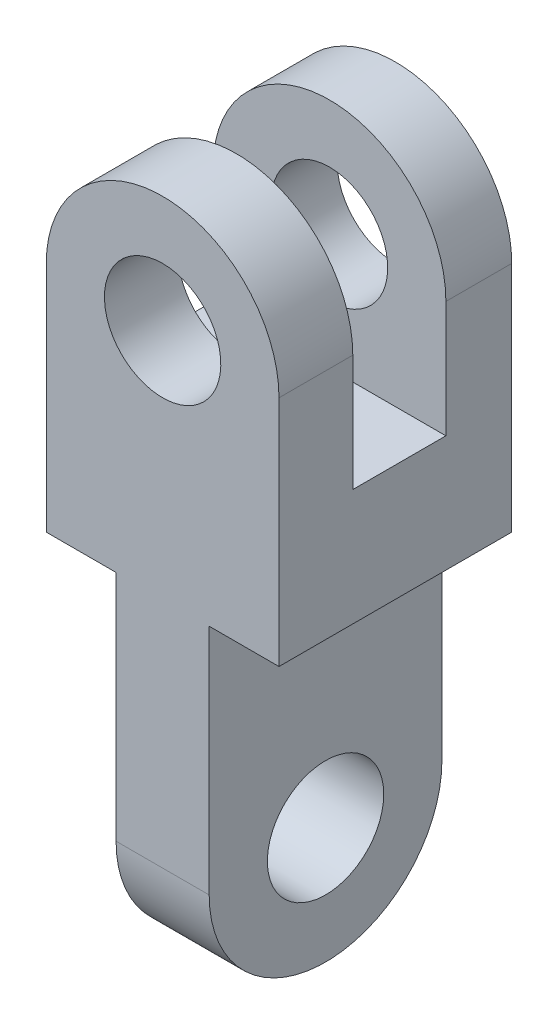
ISO-10303-21;
HEADER;
FILE_DESCRIPTION(('STEP AP214'),'2;1');
FILE_NAME('part.step','',(''),(''),'','','');
FILE_SCHEMA(('AUTOMOTIVE_DESIGN { 1 0 10303 214 1 1 1 1 }'));
ENDSEC;
DATA;
#1=APPLICATION_CONTEXT('core data for automotive mechanical design processes');
#2=APPLICATION_PROTOCOL_DEFINITION('international standard','automotive_design',2000,#1);
#3=PRODUCT_CONTEXT('',#1,'mechanical');
#4=PRODUCT('Part','Part','',(#3));
#5=PRODUCT_RELATED_PRODUCT_CATEGORY('part','',(#4));
#6=PRODUCT_DEFINITION_FORMATION('','',#4);
#7=PRODUCT_DEFINITION_CONTEXT('part definition',#1,'design');
#8=PRODUCT_DEFINITION('design','',#6,#7);
#9=PRODUCT_DEFINITION_SHAPE('','',#8);
#10=(LENGTH_UNIT() NAMED_UNIT(*) SI_UNIT(.MILLI.,.METRE.));
#11=(NAMED_UNIT(*) PLANE_ANGLE_UNIT() SI_UNIT($,.RADIAN.));
#12=(NAMED_UNIT(*) SI_UNIT($,.STERADIAN.) SOLID_ANGLE_UNIT());
#13=UNCERTAINTY_MEASURE_WITH_UNIT(LENGTH_MEASURE(1.E-05),#10,'distance_accuracy_value','');
#14=(GEOMETRIC_REPRESENTATION_CONTEXT(3) GLOBAL_UNCERTAINTY_ASSIGNED_CONTEXT((#13)) GLOBAL_UNIT_ASSIGNED_CONTEXT((#10,
#11,#12)) REPRESENTATION_CONTEXT('',''));
#15=CARTESIAN_POINT('',(0.,0.,0.));
#16=DIRECTION('',(0.,0.,1.));
#17=DIRECTION('',(1.,0.,0.));
#18=AXIS2_PLACEMENT_3D('',#15,#16,#17);
#19=CARTESIAN_POINT('',(0.,99.9999999999999,230.2775637732));
#20=DIRECTION('',(0.,0.,-1.));
#21=DIRECTION('',(0.,1.,0.));
#22=AXIS2_PLACEMENT_3D('',#19,#20,#21);
#23=CYLINDRICAL_SURFACE('',#22,50.);
#24=CARTESIAN_POINT('',(0.,100.,-21.7065790789583));
#25=DIRECTION('',(0.,0.,-1.));
#26=DIRECTION('',(0.,1.,0.));
#27=AXIS2_PLACEMENT_3D('',#24,#25,#26);
#28=CIRCLE('',#27,50.);
#29=CARTESIAN_POINT('',(50.,100.,-21.7065790789583));
#30=VERTEX_POINT('',#29);
#31=CARTESIAN_POINT('',(-50.,100.,-21.7065790789583));
#32=VERTEX_POINT('',#31);
#33=EDGE_CURVE('E163',#30,#32,#28,.F.);
#34=ORIENTED_EDGE('',*,*,#33,.F.);
#35=DIRECTION('',(0.,0.,-1.));
#36=VECTOR('',#35,1.);
#37=CARTESIAN_POINT('',(50.,99.9999999999999,230.2775637732));
#38=LINE('',#37,#36);
#39=CARTESIAN_POINT('',(50.,100.,-50.));
#40=VERTEX_POINT('',#39);
#41=EDGE_CURVE('E238',#30,#40,#38,.T.);
#42=ORIENTED_EDGE('',*,*,#41,.T.);
#43=CARTESIAN_POINT('',(0.,100.,-50.));
#44=DIRECTION('',(0.,0.,-1.));
#45=DIRECTION('',(0.,-1.,0.));
#46=AXIS2_PLACEMENT_3D('',#43,#44,#45);
#47=CIRCLE('',#46,50.);
#48=CARTESIAN_POINT('',(-50.,100.,-50.));
#49=VERTEX_POINT('',#48);
#50=EDGE_CURVE('E215',#49,#40,#47,.T.);
#51=ORIENTED_EDGE('',*,*,#50,.F.);
#52=DIRECTION('',(0.,0.,-1.));
#53=VECTOR('',#52,1.);
#54=CARTESIAN_POINT('',(-50.,100.,230.2775637732));
#55=LINE('',#54,#53);
#56=EDGE_CURVE('E227',#32,#49,#55,.T.);
#57=ORIENTED_EDGE('',*,*,#56,.F.);
#58=EDGE_LOOP('',(#34,#42,#51,#57));
#59=FACE_BOUND('',#58,.T.);
#60=ADVANCED_FACE('F45',(#59),#23,.T.);
#61=CARTESIAN_POINT('',(0.,99.9999999999999,230.2775637732));
#62=DIRECTION('',(0.,0.,-1.));
#63=DIRECTION('',(0.,1.,0.));
#64=AXIS2_PLACEMENT_3D('',#61,#62,#63);
#65=CYLINDRICAL_SURFACE('',#64,25.);
#66=CARTESIAN_POINT('',(0.,100.,-21.7065790789583));
#67=DIRECTION('',(0.,0.,-1.));
#68=DIRECTION('',(0.,1.,0.));
#69=AXIS2_PLACEMENT_3D('',#66,#67,#68);
#70=CIRCLE('',#69,25.);
#71=CARTESIAN_POINT('',(0.,125.,-21.7065790789583));
#72=VERTEX_POINT('',#71);
#73=EDGE_CURVE('E49',#72,#72,#70,.F.);
#74=CARTESIAN_POINT('',(0.,100.,-50.));
#75=DIRECTION('',(0.,0.,-1.));
#76=DIRECTION('',(0.,1.,0.));
#77=AXIS2_PLACEMENT_3D('',#74,#75,#76);
#78=CIRCLE('',#77,25.);
#79=CARTESIAN_POINT('',(0.,125.,-50.));
#80=VERTEX_POINT('',#79);
#81=EDGE_CURVE('E192',#80,#80,#78,.T.);
#82=CARTESIAN_POINT('',(0.,125.,-21.7065790789583));
#83=CARTESIAN_POINT('',(0.,125.,-22.0013022135525));
#84=CARTESIAN_POINT('',(0.,125.,-22.2960253481467));
#85=CARTESIAN_POINT('',(0.,125.,-22.885471617335));
#86=CARTESIAN_POINT('',(0.,125.,-23.1801947519292));
#87=CARTESIAN_POINT('',(0.,125.,-23.7696410211176));
#88=CARTESIAN_POINT('',(0.,125.,-24.0643641557118));
#89=CARTESIAN_POINT('',(0.,125.,-24.6538104249001));
#90=CARTESIAN_POINT('',(0.,125.,-24.9485335594943));
#91=CARTESIAN_POINT('',(0.,125.,-25.5379798286827));
#92=CARTESIAN_POINT('',(0.,125.,-25.8327029632769));
#93=CARTESIAN_POINT('',(0.,125.,-26.4221492324652));
#94=CARTESIAN_POINT('',(0.,125.,-26.7168723670594));
#95=CARTESIAN_POINT('',(0.,125.,-27.3063186362478));
#96=CARTESIAN_POINT('',(0.,125.,-27.601041770842));
#97=CARTESIAN_POINT('',(0.,125.,-28.1904880400303));
#98=CARTESIAN_POINT('',(0.,125.,-28.4852111746245));
#99=CARTESIAN_POINT('',(0.,125.,-29.0746574438129));
#100=CARTESIAN_POINT('',(0.,125.,-29.3693805784071));
#101=CARTESIAN_POINT('',(0.,125.,-29.9588268475955));
#102=CARTESIAN_POINT('',(0.,125.,-30.2535499821896));
#103=CARTESIAN_POINT('',(0.,125.,-30.842996251378));
#104=CARTESIAN_POINT('',(0.,125.,-31.1377193859722));
#105=CARTESIAN_POINT('',(0.,125.,-31.7271656551606));
#106=CARTESIAN_POINT('',(0.,125.,-32.0218887897547));
#107=CARTESIAN_POINT('',(0.,125.,-32.6113350589431));
#108=CARTESIAN_POINT('',(0.,125.,-32.9060581935373));
#109=CARTESIAN_POINT('',(0.,125.,-33.4955044627257));
#110=CARTESIAN_POINT('',(0.,125.,-33.7902275973198));
#111=CARTESIAN_POINT('',(0.,125.,-34.3796738665082));
#112=CARTESIAN_POINT('',(0.,125.,-34.6743970011024));
#113=CARTESIAN_POINT('',(0.,125.,-35.2638432702908));
#114=CARTESIAN_POINT('',(0.,125.,-35.5585664048849));
#115=CARTESIAN_POINT('',(0.,125.,-36.1480126740733));
#116=CARTESIAN_POINT('',(0.,125.,-36.4427358086675));
#117=CARTESIAN_POINT('',(0.,125.,-37.0321820778559));
#118=CARTESIAN_POINT('',(0.,125.,-37.3269052124501));
#119=CARTESIAN_POINT('',(0.,125.,-37.9163514816384));
#120=CARTESIAN_POINT('',(0.,125.,-38.2110746162326));
#121=CARTESIAN_POINT('',(0.,125.,-38.800520885421));
#122=CARTESIAN_POINT('',(0.,125.,-39.0952440200152));
#123=CARTESIAN_POINT('',(0.,125.,-39.6846902892035));
#124=CARTESIAN_POINT('',(0.,125.,-39.9794134237977));
#125=CARTESIAN_POINT('',(0.,125.,-40.5688596929861));
#126=CARTESIAN_POINT('',(0.,125.,-40.8635828275803));
#127=CARTESIAN_POINT('',(0.,125.,-41.4530290967686));
#128=CARTESIAN_POINT('',(0.,125.,-41.7477522313628));
#129=CARTESIAN_POINT('',(0.,125.,-42.3371985005512));
#130=CARTESIAN_POINT('',(0.,125.,-42.6319216351454));
#131=CARTESIAN_POINT('',(0.,125.,-43.2213679043338));
#132=CARTESIAN_POINT('',(0.,125.,-43.5160910389279));
#133=CARTESIAN_POINT('',(0.,125.,-44.1055373081163));
#134=CARTESIAN_POINT('',(0.,125.,-44.4002604427105));
#135=CARTESIAN_POINT('',(0.,125.,-44.9897067118989));
#136=CARTESIAN_POINT('',(0.,125.,-45.284429846493));
#137=CARTESIAN_POINT('',(0.,125.,-45.8738761156814));
#138=CARTESIAN_POINT('',(0.,125.,-46.1685992502756));
#139=CARTESIAN_POINT('',(0.,125.,-46.758045519464));
#140=CARTESIAN_POINT('',(0.,125.,-47.0527686540581));
#141=CARTESIAN_POINT('',(0.,125.,-47.6422149232465));
#142=CARTESIAN_POINT('',(0.,125.,-47.9369380578407));
#143=CARTESIAN_POINT('',(0.,125.,-48.5263843270291));
#144=CARTESIAN_POINT('',(0.,125.,-48.8211074616232));
#145=CARTESIAN_POINT('',(0.,125.,-49.4105537308116));
#146=CARTESIAN_POINT('',(0.,125.,-49.7052768654058));
#147=CARTESIAN_POINT('',(0.,125.,-50.));
#148=B_SPLINE_CURVE_WITH_KNOTS('',3,(#82,#83,#84,#85,#86,#87,#88,#89,#90,#91,#92,#93,#94,#95,
#96,#97,#98,#99,#100,#101,#102,#103,#104,#105,#106,#107,#108,#109,#110,#111,#112,#113,#114,#115,
#116,#117,#118,#119,#120,#121,#122,#123,#124,#125,#126,#127,#128,#129,#130,#131,#132,#133,#134,
#135,#136,#137,#138,#139,#140,#141,#142,#143,#144,#145,#146,#147),.UNSPECIFIED.,.F.,.F.,(4,2,2,
2,2,2,2,2,2,2,2,2,2,2,2,2,2,2,2,2,2,2,2,2,2,2,2,2,2,2,2,2,4),(0.,0.884169403782553,
1.76833880756511,2.65250821134766,3.53667761513021,4.42084701891277,5.30501642269532,
6.18918582647787,7.07335523026043,7.95752463404298,8.84169403782553,9.72586344160808,
10.6100328453906,11.4942022491732,12.3783716529557,13.2625410567383,14.1467104605209,
15.0308798643034,15.915049268086,16.7992186718685,17.6833880756511,18.5675574794336,
19.4517268832162,20.3358962869987,21.2200656907813,22.1042350945638,22.9884044983464,
23.8725739021289,24.7567433059115,25.640912709694,26.5250821134766,27.4092515172591,
28.2934209210417),.UNSPECIFIED.);
#149=EDGE_CURVE('BSEAM295',#72,#80,#148,.T.);
#150=ORIENTED_EDGE('',*,*,#73,.T.);
#151=ORIENTED_EDGE('',*,*,#81,.T.);
#152=ORIENTED_EDGE('',*,*,#149,.T.);
#153=ORIENTED_EDGE('',*,*,#149,.F.);
#154=EDGE_LOOP('',(#150,#152,#151,#153));
#155=FACE_BOUND('',#154,.T.);
#156=ADVANCED_FACE('F295',(#155),#65,.F.);
#157=CARTESIAN_POINT('',(20.,-100.,0.));
#158=DIRECTION('',(1.,0.,0.));
#159=DIRECTION('',(0.,0.,-1.));
#160=AXIS2_PLACEMENT_3D('',#157,#158,#159);
#161=PLANE('',#160);
#162=CARTESIAN_POINT('',(20.,-100.,0.));
#163=DIRECTION('',(1.,0.,0.));
#164=DIRECTION('',(0.,0.,-1.));
#165=AXIS2_PLACEMENT_3D('',#162,#163,#164);
#166=CIRCLE('',#165,50.);
#167=CARTESIAN_POINT('',(20.,-100.,50.));
#168=VERTEX_POINT('',#167);
#169=CARTESIAN_POINT('',(20.,-100.,-50.));
#170=VERTEX_POINT('',#169);
#171=EDGE_CURVE('E254',#168,#170,#166,.T.);
#172=ORIENTED_EDGE('',*,*,#171,.T.);
#173=DIRECTION('',(0.,1.,0.));
#174=VECTOR('',#173,1.);
#175=CARTESIAN_POINT('',(20.,0.,-50.));
#176=LINE('',#175,#174);
#177=CARTESIAN_POINT('',(20.,0.,-50.));
#178=VERTEX_POINT('',#177);
#179=EDGE_CURVE('E93',#170,#178,#176,.T.);
#180=ORIENTED_EDGE('',*,*,#179,.T.);
#181=DIRECTION('',(0.,0.,1.));
#182=VECTOR('',#181,1.);
#183=CARTESIAN_POINT('',(20.,0.,50.));
#184=LINE('',#183,#182);
#185=CARTESIAN_POINT('',(20.,0.,50.));
#186=VERTEX_POINT('',#185);
#187=EDGE_CURVE('E259',#178,#186,#184,.T.);
#188=ORIENTED_EDGE('',*,*,#187,.T.);
#189=DIRECTION('',(0.,-1.,0.));
#190=VECTOR('',#189,1.);
#191=CARTESIAN_POINT('',(20.,0.,50.));
#192=LINE('',#191,#190);
#193=EDGE_CURVE('E72',#186,#168,#192,.T.);
#194=ORIENTED_EDGE('',*,*,#193,.T.);
#195=EDGE_LOOP('',(#172,#180,#188,#194));
#196=FACE_BOUND('',#195,.T.);
#197=CARTESIAN_POINT('',(20.,-100.,0.));
#198=DIRECTION('',(1.,0.,0.));
#199=DIRECTION('',(0.,0.,-1.));
#200=AXIS2_PLACEMENT_3D('',#197,#198,#199);
#201=CIRCLE('',#200,25.);
#202=CARTESIAN_POINT('',(20.,-100.,-25.));
#203=VERTEX_POINT('',#202);
#204=EDGE_CURVE('E246',#203,#203,#201,.T.);
#205=ORIENTED_EDGE('',*,*,#204,.F.);
#206=EDGE_LOOP('',(#205));
#207=FACE_BOUND('',#206,.T.);
#208=ADVANCED_FACE('F303',(#196,#207),#161,.T.);
#209=CARTESIAN_POINT('',(-20.,-100.,0.));
#210=DIRECTION('',(1.,0.,0.));
#211=DIRECTION('',(0.,0.,-1.));
#212=AXIS2_PLACEMENT_3D('',#209,#210,#211);
#213=PLANE('',#212);
#214=CARTESIAN_POINT('',(-20.,-100.,0.));
#215=DIRECTION('',(1.,0.,0.));
#216=DIRECTION('',(0.,0.,-1.));
#217=AXIS2_PLACEMENT_3D('',#214,#215,#216);
#218=CIRCLE('',#217,50.);
#219=CARTESIAN_POINT('',(-20.,-100.,50.));
#220=VERTEX_POINT('',#219);
#221=CARTESIAN_POINT('',(-20.,-100.,-50.));
#222=VERTEX_POINT('',#221);
#223=EDGE_CURVE('E250',#220,#222,#218,.T.);
#224=ORIENTED_EDGE('',*,*,#223,.F.);
#225=DIRECTION('',(0.,-1.,0.));
#226=VECTOR('',#225,1.);
#227=CARTESIAN_POINT('',(-20.,0.,50.));
#228=LINE('',#227,#226);
#229=CARTESIAN_POINT('',(-20.,0.,50.));
#230=VERTEX_POINT('',#229);
#231=EDGE_CURVE('E87',#230,#220,#228,.T.);
#232=ORIENTED_EDGE('',*,*,#231,.F.);
#233=DIRECTION('',(0.,0.,1.));
#234=VECTOR('',#233,1.);
#235=CARTESIAN_POINT('',(-20.,0.,50.));
#236=LINE('',#235,#234);
#237=CARTESIAN_POINT('',(-20.,0.,-50.));
#238=VERTEX_POINT('',#237);
#239=EDGE_CURVE('E271',#238,#230,#236,.T.);
#240=ORIENTED_EDGE('',*,*,#239,.F.);
#241=DIRECTION('',(0.,1.,0.));
#242=VECTOR('',#241,1.);
#243=CARTESIAN_POINT('',(-20.,0.,-50.));
#244=LINE('',#243,#242);
#245=EDGE_CURVE('E267',#222,#238,#244,.T.);
#246=ORIENTED_EDGE('',*,*,#245,.F.);
#247=EDGE_LOOP('',(#224,#232,#240,#246));
#248=FACE_BOUND('',#247,.T.);
#249=CARTESIAN_POINT('',(-20.,-100.,0.));
#250=DIRECTION('',(1.,0.,0.));
#251=DIRECTION('',(0.,0.,-1.));
#252=AXIS2_PLACEMENT_3D('',#249,#250,#251);
#253=CIRCLE('',#252,25.);
#254=CARTESIAN_POINT('',(-20.,-100.,-25.));
#255=VERTEX_POINT('',#254);
#256=EDGE_CURVE('E245',#255,#255,#253,.T.);
#257=ORIENTED_EDGE('',*,*,#256,.T.);
#258=EDGE_LOOP('',(#257));
#259=FACE_BOUND('',#258,.T.);
#260=ADVANCED_FACE('F336',(#248,#259),#213,.F.);
#261=CARTESIAN_POINT('',(20.,-100.,0.));
#262=DIRECTION('',(-1.,0.,0.));
#263=DIRECTION('',(0.,0.,1.));
#264=AXIS2_PLACEMENT_3D('',#261,#262,#263);
#265=CYLINDRICAL_SURFACE('',#264,50.);
#266=ORIENTED_EDGE('',*,*,#223,.T.);
#267=DIRECTION('',(-1.,0.,0.));
#268=VECTOR('',#267,1.);
#269=CARTESIAN_POINT('',(20.,-100.,-50.));
#270=LINE('',#269,#268);
#271=EDGE_CURVE('E11',#170,#222,#270,.T.);
#272=ORIENTED_EDGE('',*,*,#271,.F.);
#273=ORIENTED_EDGE('',*,*,#171,.F.);
#274=DIRECTION('',(-1.,0.,0.));
#275=VECTOR('',#274,1.);
#276=CARTESIAN_POINT('',(20.,-100.,50.));
#277=LINE('',#276,#275);
#278=EDGE_CURVE('E55',#168,#220,#277,.T.);
#279=ORIENTED_EDGE('',*,*,#278,.T.);
#280=EDGE_LOOP('',(#266,#272,#273,#279));
#281=FACE_BOUND('',#280,.T.);
#282=ADVANCED_FACE('F47',(#281),#265,.T.);
#283=CARTESIAN_POINT('',(20.,0.,-50.));
#284=DIRECTION('',(0.,0.,1.));
#285=DIRECTION('',(0.,-1.,0.));
#286=AXIS2_PLACEMENT_3D('',#283,#284,#285);
#287=PLANE('',#286);
#288=ORIENTED_EDGE('',*,*,#245,.T.);
#289=DIRECTION('',(-1.,0.,0.));
#290=VECTOR('',#289,1.);
#291=CARTESIAN_POINT('',(50.,0.,-50.));
#292=LINE('',#291,#290);
#293=CARTESIAN_POINT('',(-50.,0.,-50.));
#294=VERTEX_POINT('',#293);
#295=EDGE_CURVE('E223',#238,#294,#292,.T.);
#296=ORIENTED_EDGE('',*,*,#295,.T.);
#297=DIRECTION('',(0.,1.,0.));
#298=VECTOR('',#297,1.);
#299=CARTESIAN_POINT('',(-50.,100.,-50.));
#300=LINE('',#299,#298);
#301=EDGE_CURVE('E211',#294,#49,#300,.T.);
#302=ORIENTED_EDGE('',*,*,#301,.T.);
#303=ORIENTED_EDGE('',*,*,#50,.T.);
#304=DIRECTION('',(0.,-1.,0.));
#305=VECTOR('',#304,1.);
#306=CARTESIAN_POINT('',(50.,0.,-50.));
#307=LINE('',#306,#305);
#308=CARTESIAN_POINT('',(50.,0.,-50.));
#309=VERTEX_POINT('',#308);
#310=EDGE_CURVE('E219',#40,#309,#307,.T.);
#311=ORIENTED_EDGE('',*,*,#310,.T.);
#312=EDGE_CURVE('E224',#309,#178,#292,.T.);
#313=ORIENTED_EDGE('',*,*,#312,.T.);
#314=ORIENTED_EDGE('',*,*,#179,.F.);
#315=ORIENTED_EDGE('',*,*,#271,.T.);
#316=EDGE_LOOP('',(#288,#296,#302,#303,#311,#313,#314,#315));
#317=FACE_BOUND('',#316,.T.);
#318=ORIENTED_EDGE('',*,*,#81,.F.);
#319=EDGE_LOOP('',(#318));
#320=FACE_BOUND('',#319,.T.);
#321=ADVANCED_FACE('F346',(#317,#320),#287,.F.);
#322=CARTESIAN_POINT('',(20.,0.,50.));
#323=DIRECTION('',(0.,0.,-1.));
#324=DIRECTION('',(0.,1.,0.));
#325=AXIS2_PLACEMENT_3D('',#322,#323,#324);
#326=PLANE('',#325);
#327=ORIENTED_EDGE('',*,*,#231,.T.);
#328=ORIENTED_EDGE('',*,*,#278,.F.);
#329=ORIENTED_EDGE('',*,*,#193,.F.);
#330=DIRECTION('',(1.,0.,0.));
#331=VECTOR('',#330,1.);
#332=CARTESIAN_POINT('',(50.,0.,50.));
#333=LINE('',#332,#331);
#334=CARTESIAN_POINT('',(50.,0.,50.));
#335=VERTEX_POINT('',#334);
#336=EDGE_CURVE('E201',#186,#335,#333,.T.);
#337=ORIENTED_EDGE('',*,*,#336,.T.);
#338=DIRECTION('',(0.,1.,0.));
#339=VECTOR('',#338,1.);
#340=CARTESIAN_POINT('',(50.,0.,50.));
#341=LINE('',#340,#339);
#342=CARTESIAN_POINT('',(50.,100.,50.));
#343=VERTEX_POINT('',#342);
#344=EDGE_CURVE('E198',#335,#343,#341,.T.);
#345=ORIENTED_EDGE('',*,*,#344,.T.);
#346=CARTESIAN_POINT('',(0.,100.,50.));
#347=DIRECTION('',(0.,0.,-1.));
#348=DIRECTION('',(0.,1.,0.));
#349=AXIS2_PLACEMENT_3D('',#346,#347,#348);
#350=CIRCLE('',#349,50.);
#351=CARTESIAN_POINT('',(-50.,100.,50.));
#352=VERTEX_POINT('',#351);
#353=EDGE_CURVE('E193',#343,#352,#350,.F.);
#354=ORIENTED_EDGE('',*,*,#353,.T.);
#355=DIRECTION('',(0.,-1.,0.));
#356=VECTOR('',#355,1.);
#357=CARTESIAN_POINT('',(-50.,100.,50.));
#358=LINE('',#357,#356);
#359=CARTESIAN_POINT('',(-50.,0.,50.));
#360=VERTEX_POINT('',#359);
#361=EDGE_CURVE('E197',#352,#360,#358,.T.);
#362=ORIENTED_EDGE('',*,*,#361,.T.);
#363=EDGE_CURVE('E203',#360,#230,#333,.T.);
#364=ORIENTED_EDGE('',*,*,#363,.T.);
#365=EDGE_LOOP('',(#327,#328,#329,#337,#345,#354,#362,#364));
#366=FACE_BOUND('',#365,.T.);
#367=CARTESIAN_POINT('',(0.,100.,50.));
#368=DIRECTION('',(0.,0.,-1.));
#369=DIRECTION('',(0.,1.,0.));
#370=AXIS2_PLACEMENT_3D('',#367,#368,#369);
#371=CIRCLE('',#370,25.);
#372=CARTESIAN_POINT('',(0.,125.,50.));
#373=VERTEX_POINT('',#372);
#374=EDGE_CURVE('E196',#373,#373,#371,.F.);
#375=ORIENTED_EDGE('',*,*,#374,.F.);
#376=EDGE_LOOP('',(#375));
#377=FACE_BOUND('',#376,.T.);
#378=ADVANCED_FACE('F330',(#366,#377),#326,.F.);
#379=CARTESIAN_POINT('',(20.,-100.,0.));
#380=DIRECTION('',(-1.,0.,0.));
#381=DIRECTION('',(0.,0.,1.));
#382=AXIS2_PLACEMENT_3D('',#379,#380,#381);
#383=CYLINDRICAL_SURFACE('',#382,25.);
#384=ORIENTED_EDGE('',*,*,#204,.T.);
#385=EDGE_LOOP('',(#384));
#386=FACE_BOUND('',#385,.T.);
#387=ORIENTED_EDGE('',*,*,#256,.F.);
#388=EDGE_LOOP('',(#387));
#389=FACE_BOUND('',#388,.T.);
#390=ADVANCED_FACE('F318',(#386,#389),#383,.F.);
#391=CARTESIAN_POINT('',(50.,0.,230.2775637732));
#392=DIRECTION('',(0.,-1.,0.));
#393=DIRECTION('',(0.,0.,-1.));
#394=AXIS2_PLACEMENT_3D('',#391,#392,#393);
#395=PLANE('',#394);
#396=ORIENTED_EDGE('',*,*,#187,.F.);
#397=ORIENTED_EDGE('',*,*,#312,.F.);
#398=DIRECTION('',(0.,0.,-1.));
#399=VECTOR('',#398,1.);
#400=CARTESIAN_POINT('',(50.,0.,230.2775637732));
#401=LINE('',#400,#399);
#402=EDGE_CURVE('E231',#335,#309,#401,.T.);
#403=ORIENTED_EDGE('',*,*,#402,.F.);
#404=ORIENTED_EDGE('',*,*,#336,.F.);
#405=EDGE_LOOP('',(#396,#397,#403,#404));
#406=FACE_BOUND('',#405,.T.);
#407=ADVANCED_FACE('F310',(#406),#395,.T.);
#408=CARTESIAN_POINT('',(0.,100.,18.2934209210417));
#409=DIRECTION('',(0.,0.,1.));
#410=DIRECTION('',(0.,-1.,0.));
#411=AXIS2_PLACEMENT_3D('',#408,#409,#410);
#412=CIRCLE('',#411,50.);
#413=CARTESIAN_POINT('',(-50.,100.,18.2934209210417));
#414=VERTEX_POINT('',#413);
#415=CARTESIAN_POINT('',(50.,100.,18.2934209210417));
#416=VERTEX_POINT('',#415);
#417=EDGE_CURVE('E182',#414,#416,#412,.F.);
#418=ORIENTED_EDGE('',*,*,#417,.F.);
#419=EDGE_CURVE('E239',#352,#414,#55,.T.);
#420=ORIENTED_EDGE('',*,*,#419,.F.);
#421=ORIENTED_EDGE('',*,*,#353,.F.);
#422=EDGE_CURVE('E234',#343,#416,#38,.T.);
#423=ORIENTED_EDGE('',*,*,#422,.T.);
#424=EDGE_LOOP('',(#418,#420,#421,#423));
#425=FACE_BOUND('',#424,.T.);
#426=ADVANCED_FACE('F298',(#425),#23,.T.);
#427=CARTESIAN_POINT('',(50.,0.,230.2775637732));
#428=DIRECTION('',(1.,0.,0.));
#429=DIRECTION('',(0.,1.,0.));
#430=AXIS2_PLACEMENT_3D('',#427,#428,#429);
#431=PLANE('',#430);
#432=DIRECTION('',(0.,1.,0.));
#433=VECTOR('',#432,1.);
#434=CARTESIAN_POINT('',(50.,0.,-21.7065790789583));
#435=LINE('',#434,#433);
#436=CARTESIAN_POINT('',(50.,50.,-21.7065790789583));
#437=VERTEX_POINT('',#436);
#438=EDGE_CURVE('E185',#437,#30,#435,.T.);
#439=ORIENTED_EDGE('',*,*,#438,.F.);
#440=DIRECTION('',(0.,0.,-1.));
#441=VECTOR('',#440,1.);
#442=CARTESIAN_POINT('',(50.,50.,230.2775637732));
#443=LINE('',#442,#441);
#444=CARTESIAN_POINT('',(50.,50.,18.2934209210417));
#445=VERTEX_POINT('',#444);
#446=EDGE_CURVE('E151',#445,#437,#443,.T.);
#447=ORIENTED_EDGE('',*,*,#446,.F.);
#448=DIRECTION('',(0.,-1.,0.));
#449=VECTOR('',#448,1.);
#450=CARTESIAN_POINT('',(50.,0.,18.2934209210417));
#451=LINE('',#450,#449);
#452=EDGE_CURVE('E179',#416,#445,#451,.T.);
#453=ORIENTED_EDGE('',*,*,#452,.F.);
#454=ORIENTED_EDGE('',*,*,#422,.F.);
#455=ORIENTED_EDGE('',*,*,#344,.F.);
#456=ORIENTED_EDGE('',*,*,#402,.T.);
#457=ORIENTED_EDGE('',*,*,#310,.F.);
#458=ORIENTED_EDGE('',*,*,#41,.F.);
#459=EDGE_LOOP('',(#439,#447,#453,#454,#455,#456,#457,#458));
#460=FACE_BOUND('',#459,.T.);
#461=ADVANCED_FACE('F309',(#460),#431,.T.);
#462=ORIENTED_EDGE('',*,*,#295,.F.);
#463=ORIENTED_EDGE('',*,*,#239,.T.);
#464=ORIENTED_EDGE('',*,*,#363,.F.);
#465=DIRECTION('',(0.,0.,-1.));
#466=VECTOR('',#465,1.);
#467=CARTESIAN_POINT('',(-50.,0.,230.2775637732));
#468=LINE('',#467,#466);
#469=EDGE_CURVE('E202',#360,#294,#468,.T.);
#470=ORIENTED_EDGE('',*,*,#469,.T.);
#471=EDGE_LOOP('',(#462,#463,#464,#470));
#472=FACE_BOUND('',#471,.T.);
#473=ADVANCED_FACE('F315',(#472),#395,.T.);
#474=CARTESIAN_POINT('',(-50.,99.9999999999999,230.2775637732));
#475=DIRECTION('',(-1.,0.,0.));
#476=DIRECTION('',(0.,-1.,0.));
#477=AXIS2_PLACEMENT_3D('',#474,#475,#476);
#478=PLANE('',#477);
#479=DIRECTION('',(0.,1.,0.));
#480=VECTOR('',#479,1.);
#481=CARTESIAN_POINT('',(-50.,150.,-21.7065790789583));
#482=LINE('',#481,#480);
#483=CARTESIAN_POINT('',(-50.,50.0000000000001,-21.7065790789583));
#484=VERTEX_POINT('',#483);
#485=EDGE_CURVE('E160',#484,#32,#482,.T.);
#486=ORIENTED_EDGE('',*,*,#485,.T.);
#487=ORIENTED_EDGE('',*,*,#56,.T.);
#488=ORIENTED_EDGE('',*,*,#301,.F.);
#489=ORIENTED_EDGE('',*,*,#469,.F.);
#490=ORIENTED_EDGE('',*,*,#361,.F.);
#491=ORIENTED_EDGE('',*,*,#419,.T.);
#492=DIRECTION('',(0.,-1.,0.));
#493=VECTOR('',#492,1.);
#494=CARTESIAN_POINT('',(-50.,150.,18.2934209210417));
#495=LINE('',#494,#493);
#496=CARTESIAN_POINT('',(-50.,50.,18.2934209210417));
#497=VERTEX_POINT('',#496);
#498=EDGE_CURVE('E167',#414,#497,#495,.T.);
#499=ORIENTED_EDGE('',*,*,#498,.T.);
#500=DIRECTION('',(0.,0.,-1.));
#501=VECTOR('',#500,1.);
#502=CARTESIAN_POINT('',(-50.,50.0000000000001,-21.7065790789583));
#503=LINE('',#502,#501);
#504=EDGE_CURVE('E63',#497,#484,#503,.T.);
#505=ORIENTED_EDGE('',*,*,#504,.T.);
#506=EDGE_LOOP('',(#486,#487,#488,#489,#490,#491,#499,#505));
#507=FACE_BOUND('',#506,.T.);
#508=ADVANCED_FACE('F170',(#507),#478,.T.);
#509=CARTESIAN_POINT('',(0.,100.,18.2934209210417));
#510=DIRECTION('',(0.,0.,1.));
#511=DIRECTION('',(0.,-1.,0.));
#512=AXIS2_PLACEMENT_3D('',#509,#510,#511);
#513=CIRCLE('',#512,25.);
#514=CARTESIAN_POINT('',(0.,125.,18.2934209210417));
#515=VERTEX_POINT('',#514);
#516=EDGE_CURVE('E156',#515,#515,#513,.F.);
#517=CARTESIAN_POINT('',(0.,125.,18.2934209210417));
#518=CARTESIAN_POINT('',(0.,125.,18.6236977864475));
#519=CARTESIAN_POINT('',(0.,125.,18.9539746518533));
#520=CARTESIAN_POINT('',(0.,125.,19.614528382665));
#521=CARTESIAN_POINT('',(0.,125.,19.9448052480708));
#522=CARTESIAN_POINT('',(0.,125.,20.6053589788824));
#523=CARTESIAN_POINT('',(0.,125.,20.9356358442882));
#524=CARTESIAN_POINT('',(0.,125.,21.5961895750999));
#525=CARTESIAN_POINT('',(0.,125.,21.9264664405057));
#526=CARTESIAN_POINT('',(0.,125.,22.5870201713173));
#527=CARTESIAN_POINT('',(0.,125.,22.9172970367231));
#528=CARTESIAN_POINT('',(0.,125.,23.5778507675348));
#529=CARTESIAN_POINT('',(0.,125.,23.9081276329406));
#530=CARTESIAN_POINT('',(0.,125.,24.5686813637522));
#531=CARTESIAN_POINT('',(0.,125.,24.898958229158));
#532=CARTESIAN_POINT('',(0.,125.,25.5595119599697));
#533=CARTESIAN_POINT('',(0.,125.,25.8897888253755));
#534=CARTESIAN_POINT('',(0.,125.,26.5503425561871));
#535=CARTESIAN_POINT('',(0.,125.,26.8806194215929));
#536=CARTESIAN_POINT('',(0.,125.,27.5411731524046));
#537=CARTESIAN_POINT('',(0.,125.,27.8714500178104));
#538=CARTESIAN_POINT('',(0.,125.,28.532003748622));
#539=CARTESIAN_POINT('',(0.,125.,28.8622806140278));
#540=CARTESIAN_POINT('',(0.,125.,29.5228343448394));
#541=CARTESIAN_POINT('',(0.,125.,29.8531112102453));
#542=CARTESIAN_POINT('',(0.,125.,30.5136649410569));
#543=CARTESIAN_POINT('',(0.,125.,30.8439418064627));
#544=CARTESIAN_POINT('',(0.,125.,31.5044955372744));
#545=CARTESIAN_POINT('',(0.,125.,31.8347724026802));
#546=CARTESIAN_POINT('',(0.,125.,32.4953261334918));
#547=CARTESIAN_POINT('',(0.,125.,32.8256029988976));
#548=CARTESIAN_POINT('',(0.,125.,33.4861567297093));
#549=CARTESIAN_POINT('',(0.,125.,33.8164335951151));
#550=CARTESIAN_POINT('',(0.,125.,34.4769873259267));
#551=CARTESIAN_POINT('',(0.,125.,34.8072641913325));
#552=CARTESIAN_POINT('',(0.,125.,35.4678179221441));
#553=CARTESIAN_POINT('',(0.,125.,35.7980947875499));
#554=CARTESIAN_POINT('',(0.,125.,36.4586485183616));
#555=CARTESIAN_POINT('',(0.,125.,36.7889253837674));
#556=CARTESIAN_POINT('',(0.,125.,37.449479114579));
#557=CARTESIAN_POINT('',(0.,125.,37.7797559799848));
#558=CARTESIAN_POINT('',(0.,125.,38.4403097107965));
#559=CARTESIAN_POINT('',(0.,125.,38.7705865762023));
#560=CARTESIAN_POINT('',(0.,125.,39.4311403070139));
#561=CARTESIAN_POINT('',(0.,125.,39.7614171724197));
#562=CARTESIAN_POINT('',(0.,125.,40.4219709032314));
#563=CARTESIAN_POINT('',(0.,125.,40.7522477686372));
#564=CARTESIAN_POINT('',(0.,125.,41.4128014994488));
#565=CARTESIAN_POINT('',(0.,125.,41.7430783648546));
#566=CARTESIAN_POINT('',(0.,125.,42.4036320956662));
#567=CARTESIAN_POINT('',(0.,125.,42.7339089610721));
#568=CARTESIAN_POINT('',(0.,125.,43.3944626918837));
#569=CARTESIAN_POINT('',(0.,125.,43.7247395572895));
#570=CARTESIAN_POINT('',(0.,125.,44.3852932881011));
#571=CARTESIAN_POINT('',(0.,125.,44.715570153507));
#572=CARTESIAN_POINT('',(0.,125.,45.3761238843186));
#573=CARTESIAN_POINT('',(0.,125.,45.7064007497244));
#574=CARTESIAN_POINT('',(0.,125.,46.366954480536));
#575=CARTESIAN_POINT('',(0.,125.,46.6972313459419));
#576=CARTESIAN_POINT('',(0.,125.,47.3577850767535));
#577=CARTESIAN_POINT('',(0.,125.,47.6880619421593));
#578=CARTESIAN_POINT('',(0.,125.,48.3486156729709));
#579=CARTESIAN_POINT('',(0.,125.,48.6788925383767));
#580=CARTESIAN_POINT('',(0.,125.,49.3394462691884));
#581=CARTESIAN_POINT('',(0.,125.,49.6697231345942));
#582=CARTESIAN_POINT('',(0.,125.,50.));
#583=B_SPLINE_CURVE_WITH_KNOTS('',3,(#517,#518,#519,#520,#521,#522,#523,#524,#525,#526,#527,
#528,#529,#530,#531,#532,#533,#534,#535,#536,#537,#538,#539,#540,#541,#542,#543,#544,#545,#546,
#547,#548,#549,#550,#551,#552,#553,#554,#555,#556,#557,#558,#559,#560,#561,#562,#563,#564,#565,
#566,#567,#568,#569,#570,#571,#572,#573,#574,#575,#576,#577,#578,#579,#580,#581,#582),
.UNSPECIFIED.,.F.,.F.,(4,2,2,2,2,2,2,2,2,2,2,2,2,2,2,2,2,2,2,2,2,2,2,2,2,2,2,2,2,2,2,2,4),(0.,
0.990830596217435,1.9816611924349,2.97249178865233,3.96332238486979,4.95415298108723,
5.94498357730469,6.93581417352213,7.92664476973959,8.91747536595702,9.90830596217446,
10.8991365583919,11.8899671546094,12.8807977508268,13.8716283470443,14.8624589432617,
15.8532895394791,16.8441201356966,17.834950731914,18.8257813281315,19.8166119243489,
20.8074425205664,21.7982731167838,22.7891037130013,23.7799343092187,24.7707649054362,
25.7615955016536,26.7524260978711,27.7432566940885,28.734087290306,29.7249178865234,
30.7157484827408,31.7065790789583),.UNSPECIFIED.);
#584=EDGE_CURVE('BSEAM281',#515,#373,#583,.T.);
#585=ORIENTED_EDGE('',*,*,#516,.T.);
#586=ORIENTED_EDGE('',*,*,#374,.T.);
#587=ORIENTED_EDGE('',*,*,#584,.T.);
#588=ORIENTED_EDGE('',*,*,#584,.F.);
#589=EDGE_LOOP('',(#585,#587,#586,#588));
#590=FACE_BOUND('',#589,.T.);
#591=ADVANCED_FACE('F281',(#590),#65,.F.);
#592=CARTESIAN_POINT('',(-50.,150.,-21.7065790789583));
#593=DIRECTION('',(0.,0.,-1.));
#594=DIRECTION('',(0.,1.,0.));
#595=AXIS2_PLACEMENT_3D('',#592,#593,#594);
#596=PLANE('',#595);
#597=ORIENTED_EDGE('',*,*,#33,.T.);
#598=ORIENTED_EDGE('',*,*,#485,.F.);
#599=DIRECTION('',(1.,0.,0.));
#600=VECTOR('',#599,1.);
#601=CARTESIAN_POINT('',(-50.,50.0000000000001,-21.7065790789583));
#602=LINE('',#601,#600);
#603=EDGE_CURVE('E147',#484,#437,#602,.T.);
#604=ORIENTED_EDGE('',*,*,#603,.T.);
#605=ORIENTED_EDGE('',*,*,#438,.T.);
#606=EDGE_LOOP('',(#597,#598,#604,#605));
#607=FACE_BOUND('',#606,.T.);
#608=ORIENTED_EDGE('',*,*,#73,.F.);
#609=EDGE_LOOP('',(#608));
#610=FACE_BOUND('',#609,.T.);
#611=ADVANCED_FACE('F161',(#607,#610),#596,.F.);
#612=CARTESIAN_POINT('',(-50.,150.,18.2934209210417));
#613=DIRECTION('',(0.,0.,1.));
#614=DIRECTION('',(0.,-1.,0.));
#615=AXIS2_PLACEMENT_3D('',#612,#613,#614);
#616=PLANE('',#615);
#617=ORIENTED_EDGE('',*,*,#417,.T.);
#618=ORIENTED_EDGE('',*,*,#452,.T.);
#619=DIRECTION('',(1.,0.,0.));
#620=VECTOR('',#619,1.);
#621=CARTESIAN_POINT('',(-50.,50.0000000000001,18.2934209210417));
#622=LINE('',#621,#620);
#623=EDGE_CURVE('E157',#497,#445,#622,.T.);
#624=ORIENTED_EDGE('',*,*,#623,.F.);
#625=ORIENTED_EDGE('',*,*,#498,.F.);
#626=EDGE_LOOP('',(#617,#618,#624,#625));
#627=FACE_BOUND('',#626,.T.);
#628=ORIENTED_EDGE('',*,*,#516,.F.);
#629=EDGE_LOOP('',(#628));
#630=FACE_BOUND('',#629,.T.);
#631=ADVANCED_FACE('F284',(#627,#630),#616,.F.);
#632=CARTESIAN_POINT('',(-50.,50.0000000000001,-21.7065790789583));
#633=DIRECTION('',(0.,-1.,0.));
#634=DIRECTION('',(1.,0.,0.));
#635=AXIS2_PLACEMENT_3D('',#632,#633,#634);
#636=PLANE('',#635);
#637=ORIENTED_EDGE('',*,*,#446,.T.);
#638=ORIENTED_EDGE('',*,*,#603,.F.);
#639=ORIENTED_EDGE('',*,*,#504,.F.);
#640=ORIENTED_EDGE('',*,*,#623,.T.);
#641=EDGE_LOOP('',(#637,#638,#639,#640));
#642=FACE_BOUND('',#641,.T.);
#643=ADVANCED_FACE('F149',(#642),#636,.F.);
#644=CLOSED_SHELL('',(#60,#156,#208,#260,#282,#321,#378,#390,#407,#426,#461,#473,#508,#591,#611,
#631,#643));
#645=MANIFOLD_SOLID_BREP('B2',#644);
#646=ADVANCED_BREP_SHAPE_REPRESENTATION('',(#18,#645),#14);
#647=SHAPE_DEFINITION_REPRESENTATION(#9,#646);
ENDSEC;
END-ISO-10303-21;
